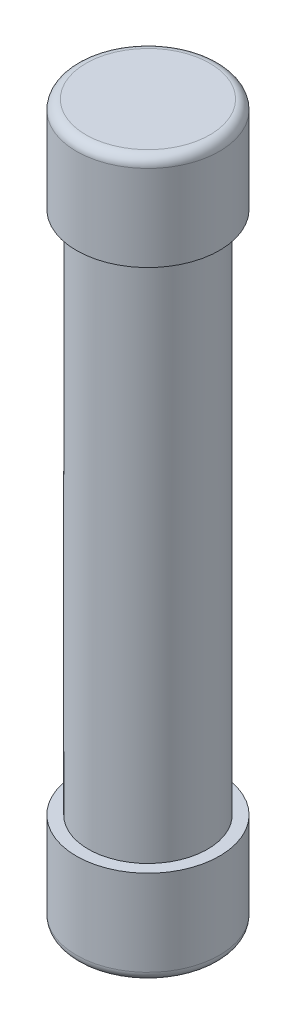
ISO-10303-21;
HEADER;
FILE_DESCRIPTION(('STEP AP214'),'2;1');
FILE_NAME('part.step','',(''),(''),'','','');
FILE_SCHEMA(('AUTOMOTIVE_DESIGN { 1 0 10303 214 1 1 1 1 }'));
ENDSEC;
DATA;
#1=APPLICATION_CONTEXT('core data for automotive mechanical design processes');
#2=APPLICATION_PROTOCOL_DEFINITION('international standard','automotive_design',2000,#1);
#3=PRODUCT_CONTEXT('',#1,'mechanical');
#4=PRODUCT('Part','Part','',(#3));
#5=PRODUCT_RELATED_PRODUCT_CATEGORY('part','',(#4));
#6=PRODUCT_DEFINITION_FORMATION('','',#4);
#7=PRODUCT_DEFINITION_CONTEXT('part definition',#1,'design');
#8=PRODUCT_DEFINITION('design','',#6,#7);
#9=PRODUCT_DEFINITION_SHAPE('','',#8);
#10=(LENGTH_UNIT() NAMED_UNIT(*) SI_UNIT(.MILLI.,.METRE.));
#11=(NAMED_UNIT(*) PLANE_ANGLE_UNIT() SI_UNIT($,.RADIAN.));
#12=(NAMED_UNIT(*) SI_UNIT($,.STERADIAN.) SOLID_ANGLE_UNIT());
#13=UNCERTAINTY_MEASURE_WITH_UNIT(LENGTH_MEASURE(1.E-05),#10,'distance_accuracy_value','');
#14=(GEOMETRIC_REPRESENTATION_CONTEXT(3) GLOBAL_UNCERTAINTY_ASSIGNED_CONTEXT((#13)) GLOBAL_UNIT_ASSIGNED_CONTEXT((#10,
#11,#12)) REPRESENTATION_CONTEXT('',''));
#15=CARTESIAN_POINT('',(0.,0.,0.));
#16=DIRECTION('',(0.,0.,1.));
#17=DIRECTION('',(1.,0.,0.));
#18=AXIS2_PLACEMENT_3D('',#15,#16,#17);
#19=CARTESIAN_POINT('',(0.,75.,0.));
#20=DIRECTION('',(0.,-1.,0.));
#21=DIRECTION('',(0.,0.,-1.));
#22=AXIS2_PLACEMENT_3D('',#19,#20,#21);
#23=CYLINDRICAL_SURFACE('',#22,12.5);
#24=CARTESIAN_POINT('',(0.,55.,0.));
#25=DIRECTION('',(0.,1.,0.));
#26=DIRECTION('',(0.,0.,1.));
#27=AXIS2_PLACEMENT_3D('',#24,#25,#26);
#28=CIRCLE('',#27,12.5);
#29=CARTESIAN_POINT('',(0.,55.,12.5));
#30=VERTEX_POINT('',#29);
#31=EDGE_CURVE('E88',#30,#30,#28,.T.);
#32=ORIENTED_EDGE('',*,*,#31,.F.);
#33=EDGE_LOOP('',(#32));
#34=FACE_BOUND('',#33,.T.);
#35=CARTESIAN_POINT('',(0.,-55.,0.));
#36=DIRECTION('',(0.,-1.,0.));
#37=DIRECTION('',(0.,0.,-1.));
#38=AXIS2_PLACEMENT_3D('',#35,#36,#37);
#39=CIRCLE('',#38,12.5);
#40=CARTESIAN_POINT('',(0.,-55.,-12.5));
#41=VERTEX_POINT('',#40);
#42=EDGE_CURVE('E85',#41,#41,#39,.T.);
#43=ORIENTED_EDGE('',*,*,#42,.F.);
#44=EDGE_LOOP('',(#43));
#45=FACE_BOUND('',#44,.T.);
#46=ADVANCED_FACE('F34',(#34,#45),#23,.T.);
#47=CARTESIAN_POINT('',(0.,55.,0.));
#48=DIRECTION('',(0.,1.,0.));
#49=DIRECTION('',(0.,0.,1.));
#50=AXIS2_PLACEMENT_3D('',#47,#48,#49);
#51=CYLINDRICAL_SURFACE('',#50,15.);
#52=CARTESIAN_POINT('',(0.,73.,0.));
#53=DIRECTION('',(0.,1.,0.));
#54=DIRECTION('',(0.,0.,1.));
#55=AXIS2_PLACEMENT_3D('',#52,#53,#54);
#56=CIRCLE('',#55,15.);
#57=CARTESIAN_POINT('',(0.,73.,15.));
#58=VERTEX_POINT('',#57);
#59=EDGE_CURVE('E51',#58,#58,#56,.F.);
#60=ORIENTED_EDGE('',*,*,#59,.T.);
#61=EDGE_LOOP('',(#60));
#62=FACE_BOUND('',#61,.T.);
#63=CARTESIAN_POINT('',(0.,55.,0.));
#64=DIRECTION('',(0.,1.,0.));
#65=DIRECTION('',(0.,0.,1.));
#66=AXIS2_PLACEMENT_3D('',#63,#64,#65);
#67=CIRCLE('',#66,15.);
#68=CARTESIAN_POINT('',(0.,55.,15.));
#69=VERTEX_POINT('',#68);
#70=EDGE_CURVE('E91',#69,#69,#67,.T.);
#71=ORIENTED_EDGE('',*,*,#70,.T.);
#72=EDGE_LOOP('',(#71));
#73=FACE_BOUND('',#72,.T.);
#74=ADVANCED_FACE('F116',(#62,#73),#51,.T.);
#75=CARTESIAN_POINT('',(0.,55.,0.));
#76=DIRECTION('',(0.,1.,0.));
#77=DIRECTION('',(0.,0.,1.));
#78=AXIS2_PLACEMENT_3D('',#75,#76,#77);
#79=PLANE('',#78);
#80=ORIENTED_EDGE('',*,*,#31,.T.);
#81=EDGE_LOOP('',(#80));
#82=FACE_BOUND('',#81,.T.);
#83=ORIENTED_EDGE('',*,*,#70,.F.);
#84=EDGE_LOOP('',(#83));
#85=FACE_BOUND('',#84,.T.);
#86=ADVANCED_FACE('F112',(#82,#85),#79,.F.);
#87=CARTESIAN_POINT('',(0.,75.,0.));
#88=DIRECTION('',(0.,1.,0.));
#89=DIRECTION('',(0.,0.,1.));
#90=AXIS2_PLACEMENT_3D('',#87,#88,#89);
#91=PLANE('',#90);
#92=CARTESIAN_POINT('',(0.,75.,0.));
#93=DIRECTION('',(0.,1.,0.));
#94=DIRECTION('',(0.,0.,1.));
#95=AXIS2_PLACEMENT_3D('',#92,#93,#94);
#96=CIRCLE('',#95,13.);
#97=CARTESIAN_POINT('',(0.,75.,13.));
#98=VERTEX_POINT('',#97);
#99=EDGE_CURVE('E72',#98,#98,#96,.T.);
#100=ORIENTED_EDGE('',*,*,#99,.T.);
#101=EDGE_LOOP('',(#100));
#102=FACE_BOUND('',#101,.T.);
#103=ADVANCED_FACE('F102',(#102),#91,.T.);
#104=CARTESIAN_POINT('',(0.,-55.,0.));
#105=DIRECTION('',(0.,-1.,0.));
#106=DIRECTION('',(0.,0.,-1.));
#107=AXIS2_PLACEMENT_3D('',#104,#105,#106);
#108=CYLINDRICAL_SURFACE('',#107,15.);
#109=CARTESIAN_POINT('',(0.,-73.,0.));
#110=DIRECTION('',(0.,1.,0.));
#111=DIRECTION('',(0.,0.,1.));
#112=AXIS2_PLACEMENT_3D('',#109,#110,#111);
#113=CIRCLE('',#112,15.);
#114=CARTESIAN_POINT('',(0.,-73.,15.));
#115=VERTEX_POINT('',#114);
#116=EDGE_CURVE('E80',#115,#115,#113,.T.);
#117=ORIENTED_EDGE('',*,*,#116,.T.);
#118=EDGE_LOOP('',(#117));
#119=FACE_BOUND('',#118,.T.);
#120=CARTESIAN_POINT('',(0.,-55.,0.));
#121=DIRECTION('',(0.,1.,0.));
#122=DIRECTION('',(0.,0.,1.));
#123=AXIS2_PLACEMENT_3D('',#120,#121,#122);
#124=CIRCLE('',#123,15.);
#125=CARTESIAN_POINT('',(0.,-55.,15.));
#126=VERTEX_POINT('',#125);
#127=EDGE_CURVE('E94',#126,#126,#124,.T.);
#128=ORIENTED_EDGE('',*,*,#127,.F.);
#129=EDGE_LOOP('',(#128));
#130=FACE_BOUND('',#129,.T.);
#131=ADVANCED_FACE('F100',(#119,#130),#108,.T.);
#132=CARTESIAN_POINT('',(0.,-55.,0.));
#133=DIRECTION('',(0.,-1.,0.));
#134=DIRECTION('',(0.,0.,1.));
#135=AXIS2_PLACEMENT_3D('',#132,#133,#134);
#136=PLANE('',#135);
#137=ORIENTED_EDGE('',*,*,#42,.T.);
#138=EDGE_LOOP('',(#137));
#139=FACE_BOUND('',#138,.T.);
#140=ORIENTED_EDGE('',*,*,#127,.T.);
#141=EDGE_LOOP('',(#140));
#142=FACE_BOUND('',#141,.T.);
#143=ADVANCED_FACE('F98',(#139,#142),#136,.F.);
#144=CARTESIAN_POINT('',(0.,-75.,0.));
#145=DIRECTION('',(0.,1.,0.));
#146=DIRECTION('',(0.,0.,1.));
#147=AXIS2_PLACEMENT_3D('',#144,#145,#146);
#148=PLANE('',#147);
#149=CARTESIAN_POINT('',(0.,-75.,0.));
#150=DIRECTION('',(0.,1.,0.));
#151=DIRECTION('',(0.,0.,1.));
#152=AXIS2_PLACEMENT_3D('',#149,#150,#151);
#153=CIRCLE('',#152,13.);
#154=CARTESIAN_POINT('',(0.,-75.,13.));
#155=VERTEX_POINT('',#154);
#156=EDGE_CURVE('E76',#155,#155,#153,.F.);
#157=ORIENTED_EDGE('',*,*,#156,.T.);
#158=EDGE_LOOP('',(#157));
#159=FACE_BOUND('',#158,.T.);
#160=ADVANCED_FACE('F109',(#159),#148,.F.);
#161=CARTESIAN_POINT('',(0.,-73.,0.));
#162=DIRECTION('',(0.,1.,0.));
#163=DIRECTION('',(0.,0.,1.));
#164=AXIS2_PLACEMENT_3D('',#161,#162,#163);
#165=TOROIDAL_SURFACE('',#164,13.,2.);
#166=ORIENTED_EDGE('',*,*,#156,.F.);
#167=EDGE_LOOP('',(#166));
#168=FACE_BOUND('',#167,.T.);
#169=ORIENTED_EDGE('',*,*,#116,.F.);
#170=EDGE_LOOP('',(#169));
#171=FACE_BOUND('',#170,.T.);
#172=ADVANCED_FACE('F127',(#168,#171),#165,.T.);
#173=CARTESIAN_POINT('',(0.,73.,0.));
#174=DIRECTION('',(0.,1.,0.));
#175=DIRECTION('',(0.,0.,1.));
#176=AXIS2_PLACEMENT_3D('',#173,#174,#175);
#177=TOROIDAL_SURFACE('',#176,13.,2.);
#178=ORIENTED_EDGE('',*,*,#59,.F.);
#179=EDGE_LOOP('',(#178));
#180=FACE_BOUND('',#179,.T.);
#181=ORIENTED_EDGE('',*,*,#99,.F.);
#182=EDGE_LOOP('',(#181));
#183=FACE_BOUND('',#182,.T.);
#184=ADVANCED_FACE('F130',(#180,#183),#177,.T.);
#185=CLOSED_SHELL('',(#46,#74,#86,#103,#131,#143,#160,#172,#184));
#186=CARTESIAN_POINT('',(0.,75.,0.));
#187=DIRECTION('',(0.,-1.,0.));
#188=DIRECTION('',(0.,0.,-1.));
#189=AXIS2_PLACEMENT_3D('',#186,#187,#188);
#190=CYLINDRICAL_SURFACE('',#189,11.5);
#191=CARTESIAN_POINT('',(0.,56.,0.));
#192=DIRECTION('',(0.,1.,0.));
#193=DIRECTION('',(0.,0.,1.));
#194=AXIS2_PLACEMENT_3D('',#191,#192,#193);
#195=CIRCLE('',#194,11.5);
#196=CARTESIAN_POINT('',(0.,56.,11.5));
#197=VERTEX_POINT('',#196);
#198=EDGE_CURVE('E62',#197,#197,#195,.T.);
#199=ORIENTED_EDGE('',*,*,#198,.T.);
#200=EDGE_LOOP('',(#199));
#201=FACE_BOUND('',#200,.T.);
#202=CARTESIAN_POINT('',(0.,-56.,0.));
#203=DIRECTION('',(0.,-1.,0.));
#204=DIRECTION('',(0.,0.,-1.));
#205=AXIS2_PLACEMENT_3D('',#202,#203,#204);
#206=CIRCLE('',#205,11.5);
#207=CARTESIAN_POINT('',(0.,-56.,-11.5));
#208=VERTEX_POINT('',#207);
#209=EDGE_CURVE('E48',#208,#208,#206,.T.);
#210=ORIENTED_EDGE('',*,*,#209,.T.);
#211=EDGE_LOOP('',(#210));
#212=FACE_BOUND('',#211,.T.);
#213=ADVANCED_FACE('F135',(#201,#212),#190,.F.);
#214=CARTESIAN_POINT('',(0.,55.,0.));
#215=DIRECTION('',(0.,1.,0.));
#216=DIRECTION('',(0.,0.,1.));
#217=AXIS2_PLACEMENT_3D('',#214,#215,#216);
#218=CYLINDRICAL_SURFACE('',#217,14.);
#219=CARTESIAN_POINT('',(0.,73.,0.));
#220=DIRECTION('',(0.,1.,0.));
#221=DIRECTION('',(0.,0.,1.));
#222=AXIS2_PLACEMENT_3D('',#219,#220,#221);
#223=CIRCLE('',#222,14.);
#224=CARTESIAN_POINT('',(0.,73.,14.));
#225=VERTEX_POINT('',#224);
#226=EDGE_CURVE('E38',#225,#225,#223,.F.);
#227=ORIENTED_EDGE('',*,*,#226,.F.);
#228=EDGE_LOOP('',(#227));
#229=FACE_BOUND('',#228,.T.);
#230=CARTESIAN_POINT('',(0.,56.,0.));
#231=DIRECTION('',(0.,1.,0.));
#232=DIRECTION('',(0.,0.,1.));
#233=AXIS2_PLACEMENT_3D('',#230,#231,#232);
#234=CIRCLE('',#233,14.);
#235=CARTESIAN_POINT('',(0.,56.,14.));
#236=VERTEX_POINT('',#235);
#237=EDGE_CURVE('E64',#236,#236,#234,.T.);
#238=ORIENTED_EDGE('',*,*,#237,.F.);
#239=EDGE_LOOP('',(#238));
#240=FACE_BOUND('',#239,.T.);
#241=ADVANCED_FACE('F138',(#229,#240),#218,.F.);
#242=CARTESIAN_POINT('',(0.,56.,0.));
#243=DIRECTION('',(0.,1.,0.));
#244=DIRECTION('',(0.,0.,1.));
#245=AXIS2_PLACEMENT_3D('',#242,#243,#244);
#246=PLANE('',#245);
#247=ORIENTED_EDGE('',*,*,#198,.F.);
#248=EDGE_LOOP('',(#247));
#249=FACE_BOUND('',#248,.T.);
#250=ORIENTED_EDGE('',*,*,#237,.T.);
#251=EDGE_LOOP('',(#250));
#252=FACE_BOUND('',#251,.T.);
#253=ADVANCED_FACE('F143',(#249,#252),#246,.T.);
#254=CARTESIAN_POINT('',(0.,74.,0.));
#255=DIRECTION('',(0.,1.,0.));
#256=DIRECTION('',(0.,0.,1.));
#257=AXIS2_PLACEMENT_3D('',#254,#255,#256);
#258=PLANE('',#257);
#259=CARTESIAN_POINT('',(0.,74.,0.));
#260=DIRECTION('',(0.,1.,0.));
#261=DIRECTION('',(0.,0.,1.));
#262=AXIS2_PLACEMENT_3D('',#259,#260,#261);
#263=CIRCLE('',#262,13.);
#264=CARTESIAN_POINT('',(0.,74.,13.));
#265=VERTEX_POINT('',#264);
#266=EDGE_CURVE('E59',#265,#265,#263,.T.);
#267=ORIENTED_EDGE('',*,*,#266,.F.);
#268=EDGE_LOOP('',(#267));
#269=FACE_BOUND('',#268,.T.);
#270=ADVANCED_FACE('F147',(#269),#258,.F.);
#271=CARTESIAN_POINT('',(0.,-55.,0.));
#272=DIRECTION('',(0.,-1.,0.));
#273=DIRECTION('',(0.,0.,-1.));
#274=AXIS2_PLACEMENT_3D('',#271,#272,#273);
#275=CYLINDRICAL_SURFACE('',#274,14.);
#276=CARTESIAN_POINT('',(0.,-73.,0.));
#277=DIRECTION('',(0.,-1.,0.));
#278=DIRECTION('',(0.,0.,-1.));
#279=AXIS2_PLACEMENT_3D('',#276,#277,#278);
#280=CIRCLE('',#279,14.);
#281=CARTESIAN_POINT('',(0.,-73.,-14.));
#282=VERTEX_POINT('',#281);
#283=EDGE_CURVE('E56',#282,#282,#280,.F.);
#284=ORIENTED_EDGE('',*,*,#283,.F.);
#285=EDGE_LOOP('',(#284));
#286=FACE_BOUND('',#285,.T.);
#287=CARTESIAN_POINT('',(0.,-56.,0.));
#288=DIRECTION('',(0.,-1.,0.));
#289=DIRECTION('',(0.,0.,-1.));
#290=AXIS2_PLACEMENT_3D('',#287,#288,#289);
#291=CIRCLE('',#290,14.);
#292=CARTESIAN_POINT('',(0.,-56.,-14.));
#293=VERTEX_POINT('',#292);
#294=EDGE_CURVE('E43',#293,#293,#291,.F.);
#295=ORIENTED_EDGE('',*,*,#294,.T.);
#296=EDGE_LOOP('',(#295));
#297=FACE_BOUND('',#296,.T.);
#298=ADVANCED_FACE('F151',(#286,#297),#275,.F.);
#299=CARTESIAN_POINT('',(0.,-56.,0.));
#300=DIRECTION('',(0.,-1.,0.));
#301=DIRECTION('',(0.,0.,1.));
#302=AXIS2_PLACEMENT_3D('',#299,#300,#301);
#303=PLANE('',#302);
#304=ORIENTED_EDGE('',*,*,#209,.F.);
#305=EDGE_LOOP('',(#304));
#306=FACE_BOUND('',#305,.T.);
#307=ORIENTED_EDGE('',*,*,#294,.F.);
#308=EDGE_LOOP('',(#307));
#309=FACE_BOUND('',#308,.T.);
#310=ADVANCED_FACE('F155',(#306,#309),#303,.T.);
#311=CARTESIAN_POINT('',(0.,-74.,0.));
#312=DIRECTION('',(0.,1.,0.));
#313=DIRECTION('',(0.,0.,1.));
#314=AXIS2_PLACEMENT_3D('',#311,#312,#313);
#315=PLANE('',#314);
#316=CARTESIAN_POINT('',(0.,-74.,0.));
#317=DIRECTION('',(0.,1.,0.));
#318=DIRECTION('',(0.,0.,1.));
#319=AXIS2_PLACEMENT_3D('',#316,#317,#318);
#320=CIRCLE('',#319,13.);
#321=CARTESIAN_POINT('',(0.,-74.,13.));
#322=VERTEX_POINT('',#321);
#323=EDGE_CURVE('E10',#322,#322,#320,.F.);
#324=ORIENTED_EDGE('',*,*,#323,.F.);
#325=EDGE_LOOP('',(#324));
#326=FACE_BOUND('',#325,.T.);
#327=ADVANCED_FACE('F159',(#326),#315,.T.);
#328=CARTESIAN_POINT('',(0.,-73.,0.));
#329=DIRECTION('',(0.,1.,0.));
#330=DIRECTION('',(0.,0.,1.));
#331=AXIS2_PLACEMENT_3D('',#328,#329,#330);
#332=TOROIDAL_SURFACE('',#331,13.,1.);
#333=ORIENTED_EDGE('',*,*,#323,.T.);
#334=EDGE_LOOP('',(#333));
#335=FACE_BOUND('',#334,.T.);
#336=ORIENTED_EDGE('',*,*,#283,.T.);
#337=EDGE_LOOP('',(#336));
#338=FACE_BOUND('',#337,.T.);
#339=ADVANCED_FACE('F162',(#335,#338),#332,.F.);
#340=CARTESIAN_POINT('',(0.,73.,0.));
#341=DIRECTION('',(0.,1.,0.));
#342=DIRECTION('',(0.,0.,1.));
#343=AXIS2_PLACEMENT_3D('',#340,#341,#342);
#344=TOROIDAL_SURFACE('',#343,13.,1.);
#345=ORIENTED_EDGE('',*,*,#226,.T.);
#346=EDGE_LOOP('',(#345));
#347=FACE_BOUND('',#346,.T.);
#348=ORIENTED_EDGE('',*,*,#266,.T.);
#349=EDGE_LOOP('',(#348));
#350=FACE_BOUND('',#349,.T.);
#351=ADVANCED_FACE('F36',(#347,#350),#344,.F.);
#352=CLOSED_SHELL('',(#213,#241,#253,#270,#298,#310,#327,#339,#351));
#353=ORIENTED_CLOSED_SHELL('',*,#352,.T.);
#354=BREP_WITH_VOIDS('B2',#185,(#353));
#355=ADVANCED_BREP_SHAPE_REPRESENTATION('',(#18,#354),#14);
#356=SHAPE_DEFINITION_REPRESENTATION(#9,#355);
ENDSEC;
END-ISO-10303-21;
